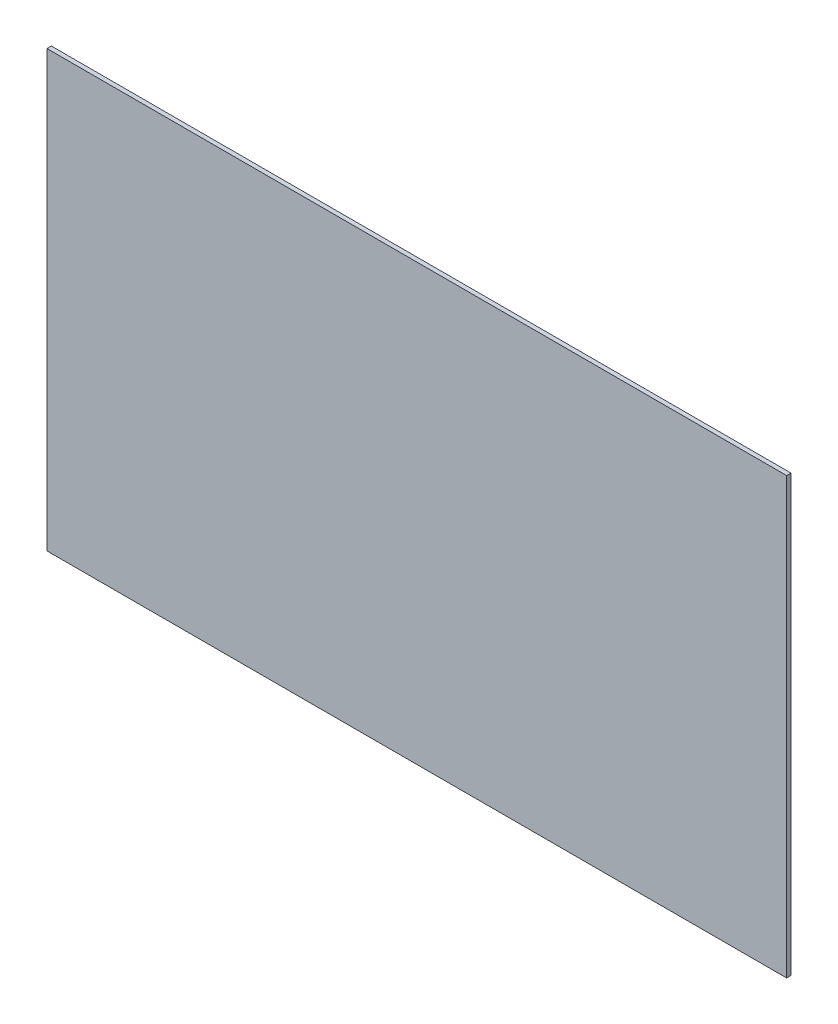
ISO-10303-21;
HEADER;
FILE_DESCRIPTION(('STEP AP214'),'2;1');
FILE_NAME('part.step','',(''),(''),'','','');
FILE_SCHEMA(('AUTOMOTIVE_DESIGN { 1 0 10303 214 1 1 1 1 }'));
ENDSEC;
DATA;
#1=APPLICATION_CONTEXT('core data for automotive mechanical design processes');
#2=APPLICATION_PROTOCOL_DEFINITION('international standard','automotive_design',2000,#1);
#3=PRODUCT_CONTEXT('',#1,'mechanical');
#4=PRODUCT('Part','Part','',(#3));
#5=PRODUCT_RELATED_PRODUCT_CATEGORY('part','',(#4));
#6=PRODUCT_DEFINITION_FORMATION('','',#4);
#7=PRODUCT_DEFINITION_CONTEXT('part definition',#1,'design');
#8=PRODUCT_DEFINITION('design','',#6,#7);
#9=PRODUCT_DEFINITION_SHAPE('','',#8);
#10=(LENGTH_UNIT() NAMED_UNIT(*) SI_UNIT(.MILLI.,.METRE.));
#11=(NAMED_UNIT(*) PLANE_ANGLE_UNIT() SI_UNIT($,.RADIAN.));
#12=(NAMED_UNIT(*) SI_UNIT($,.STERADIAN.) SOLID_ANGLE_UNIT());
#13=UNCERTAINTY_MEASURE_WITH_UNIT(LENGTH_MEASURE(1.E-05),#10,'distance_accuracy_value','');
#14=(GEOMETRIC_REPRESENTATION_CONTEXT(3) GLOBAL_UNCERTAINTY_ASSIGNED_CONTEXT((#13)) GLOBAL_UNIT_ASSIGNED_CONTEXT((#10,
#11,#12)) REPRESENTATION_CONTEXT('',''));
#15=CARTESIAN_POINT('',(0.,0.,0.));
#16=DIRECTION('',(0.,0.,1.));
#17=DIRECTION('',(1.,0.,0.));
#18=AXIS2_PLACEMENT_3D('',#15,#16,#17);
#19=CARTESIAN_POINT('',(0.,0.,0.5));
#20=DIRECTION('',(1.,0.,0.));
#21=DIRECTION('',(0.,0.,-1.));
#22=AXIS2_PLACEMENT_3D('',#19,#20,#21);
#23=PLANE('',#22);
#24=DIRECTION('',(0.,-1.,0.));
#25=VECTOR('',#24,1.);
#26=CARTESIAN_POINT('',(0.,0.,0.));
#27=LINE('',#26,#25);
#28=CARTESIAN_POINT('',(0.,50.,0.));
#29=VERTEX_POINT('',#28);
#30=CARTESIAN_POINT('',(0.,0.,0.));
#31=VERTEX_POINT('',#30);
#32=EDGE_CURVE('E101',#29,#31,#27,.T.);
#33=ORIENTED_EDGE('',*,*,#32,.T.);
#34=DIRECTION('',(0.,0.,-1.));
#35=VECTOR('',#34,1.);
#36=CARTESIAN_POINT('',(0.,0.,0.5));
#37=LINE('',#36,#35);
#38=CARTESIAN_POINT('',(0.,0.,0.5));
#39=VERTEX_POINT('',#38);
#40=EDGE_CURVE('E11',#39,#31,#37,.T.);
#41=ORIENTED_EDGE('',*,*,#40,.F.);
#42=DIRECTION('',(0.,-1.,0.));
#43=VECTOR('',#42,1.);
#44=CARTESIAN_POINT('',(0.,0.,0.5));
#45=LINE('',#44,#43);
#46=CARTESIAN_POINT('',(0.,50.,0.5));
#47=VERTEX_POINT('',#46);
#48=EDGE_CURVE('E89',#47,#39,#45,.T.);
#49=ORIENTED_EDGE('',*,*,#48,.F.);
#50=DIRECTION('',(0.,0.,-1.));
#51=VECTOR('',#50,1.);
#52=CARTESIAN_POINT('',(0.,50.,0.5));
#53=LINE('',#52,#51);
#54=EDGE_CURVE('E97',#47,#29,#53,.T.);
#55=ORIENTED_EDGE('',*,*,#54,.T.);
#56=EDGE_LOOP('',(#33,#41,#49,#55));
#57=FACE_BOUND('',#56,.T.);
#58=ADVANCED_FACE('F38',(#57),#23,.F.);
#59=CARTESIAN_POINT('',(0.,0.,0.5));
#60=DIRECTION('',(0.,1.,0.));
#61=DIRECTION('',(0.,0.,1.));
#62=AXIS2_PLACEMENT_3D('',#59,#60,#61);
#63=PLANE('',#62);
#64=DIRECTION('',(1.,0.,0.));
#65=VECTOR('',#64,1.);
#66=CARTESIAN_POINT('',(0.,0.,0.));
#67=LINE('',#66,#65);
#68=CARTESIAN_POINT('',(85.,0.,0.));
#69=VERTEX_POINT('',#68);
#70=EDGE_CURVE('E93',#31,#69,#67,.T.);
#71=ORIENTED_EDGE('',*,*,#70,.T.);
#72=DIRECTION('',(0.,0.,-1.));
#73=VECTOR('',#72,1.);
#74=CARTESIAN_POINT('',(85.,0.,0.5));
#75=LINE('',#74,#73);
#76=CARTESIAN_POINT('',(85.,0.,0.5));
#77=VERTEX_POINT('',#76);
#78=EDGE_CURVE('E46',#77,#69,#75,.T.);
#79=ORIENTED_EDGE('',*,*,#78,.F.);
#80=DIRECTION('',(1.,0.,0.));
#81=VECTOR('',#80,1.);
#82=CARTESIAN_POINT('',(0.,0.,0.5));
#83=LINE('',#82,#81);
#84=EDGE_CURVE('E84',#39,#77,#83,.T.);
#85=ORIENTED_EDGE('',*,*,#84,.F.);
#86=ORIENTED_EDGE('',*,*,#40,.T.);
#87=EDGE_LOOP('',(#71,#79,#85,#86));
#88=FACE_BOUND('',#87,.T.);
#89=ADVANCED_FACE('F92',(#88),#63,.F.);
#90=CARTESIAN_POINT('',(85.,0.,0.5));
#91=DIRECTION('',(-1.,0.,0.));
#92=DIRECTION('',(0.,0.,1.));
#93=AXIS2_PLACEMENT_3D('',#90,#91,#92);
#94=PLANE('',#93);
#95=DIRECTION('',(0.,1.,0.));
#96=VECTOR('',#95,1.);
#97=CARTESIAN_POINT('',(85.,0.,0.));
#98=LINE('',#97,#96);
#99=CARTESIAN_POINT('',(85.,50.,0.));
#100=VERTEX_POINT('',#99);
#101=EDGE_CURVE('E71',#69,#100,#98,.T.);
#102=ORIENTED_EDGE('',*,*,#101,.T.);
#103=DIRECTION('',(0.,0.,-1.));
#104=VECTOR('',#103,1.);
#105=CARTESIAN_POINT('',(85.,50.,0.5));
#106=LINE('',#105,#104);
#107=CARTESIAN_POINT('',(85.,50.,0.5));
#108=VERTEX_POINT('',#107);
#109=EDGE_CURVE('E94',#108,#100,#106,.T.);
#110=ORIENTED_EDGE('',*,*,#109,.F.);
#111=DIRECTION('',(0.,1.,0.));
#112=VECTOR('',#111,1.);
#113=CARTESIAN_POINT('',(85.,0.,0.5));
#114=LINE('',#113,#112);
#115=EDGE_CURVE('E87',#77,#108,#114,.T.);
#116=ORIENTED_EDGE('',*,*,#115,.F.);
#117=ORIENTED_EDGE('',*,*,#78,.T.);
#118=EDGE_LOOP('',(#102,#110,#116,#117));
#119=FACE_BOUND('',#118,.T.);
#120=ADVANCED_FACE('F95',(#119),#94,.F.);
#121=CARTESIAN_POINT('',(0.,50.,0.5));
#122=DIRECTION('',(0.,-1.,0.));
#123=DIRECTION('',(0.,0.,-1.));
#124=AXIS2_PLACEMENT_3D('',#121,#122,#123);
#125=PLANE('',#124);
#126=DIRECTION('',(-1.,0.,0.));
#127=VECTOR('',#126,1.);
#128=CARTESIAN_POINT('',(0.,50.,0.));
#129=LINE('',#128,#127);
#130=EDGE_CURVE('E77',#100,#29,#129,.T.);
#131=ORIENTED_EDGE('',*,*,#130,.T.);
#132=ORIENTED_EDGE('',*,*,#54,.F.);
#133=DIRECTION('',(-1.,0.,0.));
#134=VECTOR('',#133,1.);
#135=CARTESIAN_POINT('',(0.,50.,0.5));
#136=LINE('',#135,#134);
#137=EDGE_CURVE('E54',#108,#47,#136,.T.);
#138=ORIENTED_EDGE('',*,*,#137,.F.);
#139=ORIENTED_EDGE('',*,*,#109,.T.);
#140=EDGE_LOOP('',(#131,#132,#138,#139));
#141=FACE_BOUND('',#140,.T.);
#142=ADVANCED_FACE('F108',(#141),#125,.F.);
#143=CARTESIAN_POINT('',(0.,0.,0.5));
#144=DIRECTION('',(0.,0.,-1.));
#145=DIRECTION('',(-1.,0.,0.));
#146=AXIS2_PLACEMENT_3D('',#143,#144,#145);
#147=PLANE('',#146);
#148=ORIENTED_EDGE('',*,*,#48,.T.);
#149=ORIENTED_EDGE('',*,*,#84,.T.);
#150=ORIENTED_EDGE('',*,*,#115,.T.);
#151=ORIENTED_EDGE('',*,*,#137,.T.);
#152=EDGE_LOOP('',(#148,#149,#150,#151));
#153=FACE_BOUND('',#152,.T.);
#154=ADVANCED_FACE('F85',(#153),#147,.F.);
#155=CARTESIAN_POINT('',(0.,0.,0.));
#156=DIRECTION('',(0.,0.,-1.));
#157=DIRECTION('',(-1.,0.,0.));
#158=AXIS2_PLACEMENT_3D('',#155,#156,#157);
#159=PLANE('',#158);
#160=ORIENTED_EDGE('',*,*,#32,.F.);
#161=ORIENTED_EDGE('',*,*,#130,.F.);
#162=ORIENTED_EDGE('',*,*,#101,.F.);
#163=ORIENTED_EDGE('',*,*,#70,.F.);
#164=EDGE_LOOP('',(#160,#161,#162,#163));
#165=FACE_BOUND('',#164,.T.);
#166=ADVANCED_FACE('F111',(#165),#159,.T.);
#167=CLOSED_SHELL('',(#58,#89,#120,#142,#154,#166));
#168=MANIFOLD_SOLID_BREP('B2',#167);
#169=ADVANCED_BREP_SHAPE_REPRESENTATION('',(#18,#168),#14);
#170=SHAPE_DEFINITION_REPRESENTATION(#9,#169);
ENDSEC;
END-ISO-10303-21;
